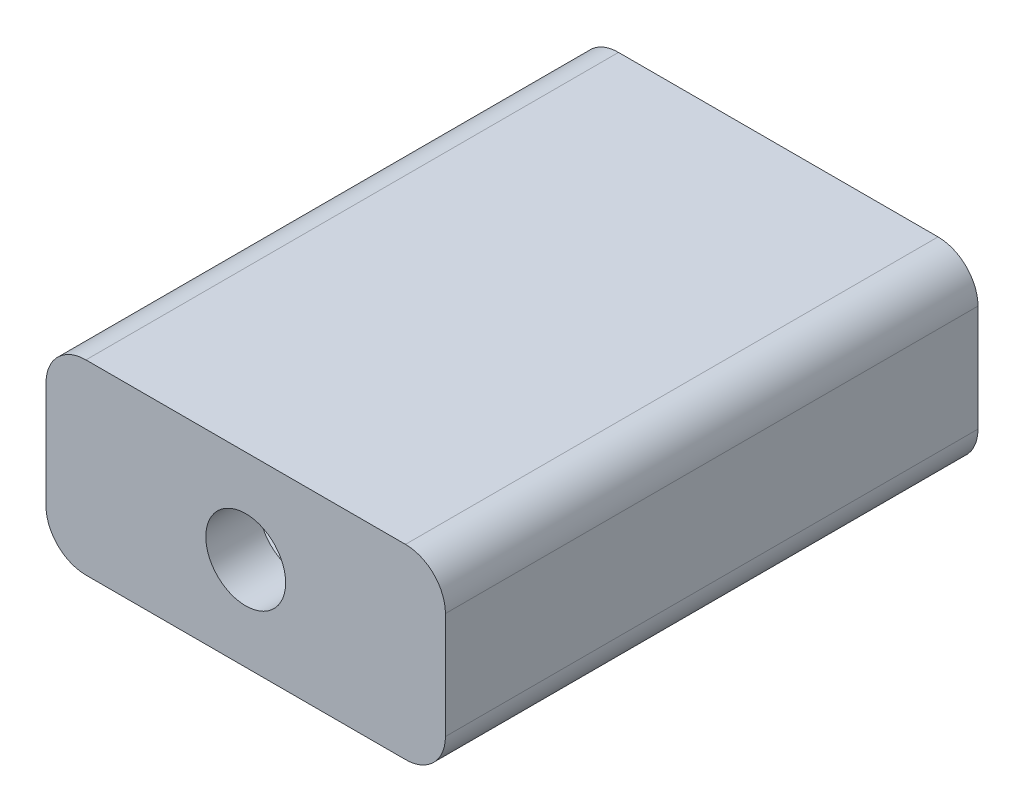
ISO-10303-21;
HEADER;
FILE_DESCRIPTION(('STEP AP214'),'2;1');
FILE_NAME('part.step','',(''),(''),'','','');
FILE_SCHEMA(('AUTOMOTIVE_DESIGN { 1 0 10303 214 1 1 1 1 }'));
ENDSEC;
DATA;
#1=APPLICATION_CONTEXT('core data for automotive mechanical design processes');
#2=APPLICATION_PROTOCOL_DEFINITION('international standard','automotive_design',2000,#1);
#3=PRODUCT_CONTEXT('',#1,'mechanical');
#4=PRODUCT('Part','Part','',(#3));
#5=PRODUCT_RELATED_PRODUCT_CATEGORY('part','',(#4));
#6=PRODUCT_DEFINITION_FORMATION('','',#4);
#7=PRODUCT_DEFINITION_CONTEXT('part definition',#1,'design');
#8=PRODUCT_DEFINITION('design','',#6,#7);
#9=PRODUCT_DEFINITION_SHAPE('','',#8);
#10=(LENGTH_UNIT() NAMED_UNIT(*) SI_UNIT(.MILLI.,.METRE.));
#11=(NAMED_UNIT(*) PLANE_ANGLE_UNIT() SI_UNIT($,.RADIAN.));
#12=(NAMED_UNIT(*) SI_UNIT($,.STERADIAN.) SOLID_ANGLE_UNIT());
#13=UNCERTAINTY_MEASURE_WITH_UNIT(LENGTH_MEASURE(1.E-05),#10,'distance_accuracy_value','');
#14=(GEOMETRIC_REPRESENTATION_CONTEXT(3) GLOBAL_UNCERTAINTY_ASSIGNED_CONTEXT((#13)) GLOBAL_UNIT_ASSIGNED_CONTEXT((#10,
#11,#12)) REPRESENTATION_CONTEXT('',''));
#15=CARTESIAN_POINT('',(0.,0.,0.));
#16=DIRECTION('',(0.,0.,1.));
#17=DIRECTION('',(1.,0.,0.));
#18=AXIS2_PLACEMENT_3D('',#15,#16,#17);
#19=CARTESIAN_POINT('',(-12.,-4.,40.));
#20=DIRECTION('',(0.,0.,-1.));
#21=DIRECTION('',(-1.,0.,0.));
#22=AXIS2_PLACEMENT_3D('',#19,#20,#21);
#23=CYLINDRICAL_SURFACE('',#22,3.);
#24=CARTESIAN_POINT('',(-12.,-4.,0.));
#25=DIRECTION('',(0.,0.,1.));
#26=DIRECTION('',(1.,0.,0.));
#27=AXIS2_PLACEMENT_3D('',#24,#25,#26);
#28=CIRCLE('',#27,3.);
#29=CARTESIAN_POINT('',(-15.,-4.,0.));
#30=VERTEX_POINT('',#29);
#31=CARTESIAN_POINT('',(-12.,-7.,0.));
#32=VERTEX_POINT('',#31);
#33=EDGE_CURVE('E145',#30,#32,#28,.T.);
#34=ORIENTED_EDGE('',*,*,#33,.T.);
#35=DIRECTION('',(0.,0.,-1.));
#36=VECTOR('',#35,1.);
#37=CARTESIAN_POINT('',(-12.,-7.,40.));
#38=LINE('',#37,#36);
#39=CARTESIAN_POINT('',(-12.,-7.,40.));
#40=VERTEX_POINT('',#39);
#41=EDGE_CURVE('E11',#40,#32,#38,.T.);
#42=ORIENTED_EDGE('',*,*,#41,.F.);
#43=CARTESIAN_POINT('',(-12.,-4.,40.));
#44=DIRECTION('',(0.,0.,1.));
#45=DIRECTION('',(1.,0.,0.));
#46=AXIS2_PLACEMENT_3D('',#43,#44,#45);
#47=CIRCLE('',#46,3.);
#48=CARTESIAN_POINT('',(-15.,-4.,40.));
#49=VERTEX_POINT('',#48);
#50=EDGE_CURVE('E161',#49,#40,#47,.T.);
#51=ORIENTED_EDGE('',*,*,#50,.F.);
#52=DIRECTION('',(0.,0.,-1.));
#53=VECTOR('',#52,1.);
#54=CARTESIAN_POINT('',(-15.,-4.,40.));
#55=LINE('',#54,#53);
#56=EDGE_CURVE('E141',#49,#30,#55,.T.);
#57=ORIENTED_EDGE('',*,*,#56,.T.);
#58=EDGE_LOOP('',(#34,#42,#51,#57));
#59=FACE_BOUND('',#58,.T.);
#60=ADVANCED_FACE('F36',(#59),#23,.T.);
#61=CARTESIAN_POINT('',(-12.,-7.,40.));
#62=DIRECTION('',(0.,1.,0.));
#63=DIRECTION('',(0.,0.,1.));
#64=AXIS2_PLACEMENT_3D('',#61,#62,#63);
#65=PLANE('',#64);
#66=DIRECTION('',(1.,0.,0.));
#67=VECTOR('',#66,1.);
#68=CARTESIAN_POINT('',(-12.,-7.,0.));
#69=LINE('',#68,#67);
#70=CARTESIAN_POINT('',(12.,-7.,0.));
#71=VERTEX_POINT('',#70);
#72=EDGE_CURVE('E148',#32,#71,#69,.T.);
#73=ORIENTED_EDGE('',*,*,#72,.T.);
#74=DIRECTION('',(0.,0.,-1.));
#75=VECTOR('',#74,1.);
#76=CARTESIAN_POINT('',(12.,-7.,40.));
#77=LINE('',#76,#75);
#78=CARTESIAN_POINT('',(12.,-7.,40.));
#79=VERTEX_POINT('',#78);
#80=EDGE_CURVE('E44',#79,#71,#77,.T.);
#81=ORIENTED_EDGE('',*,*,#80,.F.);
#82=DIRECTION('',(1.,0.,0.));
#83=VECTOR('',#82,1.);
#84=CARTESIAN_POINT('',(-12.,-7.,40.));
#85=LINE('',#84,#83);
#86=EDGE_CURVE('E101',#40,#79,#85,.T.);
#87=ORIENTED_EDGE('',*,*,#86,.F.);
#88=ORIENTED_EDGE('',*,*,#41,.T.);
#89=EDGE_LOOP('',(#73,#81,#87,#88));
#90=FACE_BOUND('',#89,.T.);
#91=ADVANCED_FACE('F245',(#90),#65,.F.);
#92=CARTESIAN_POINT('',(12.,-4.,40.));
#93=DIRECTION('',(0.,0.,-1.));
#94=DIRECTION('',(-1.,0.,0.));
#95=AXIS2_PLACEMENT_3D('',#92,#93,#94);
#96=CYLINDRICAL_SURFACE('',#95,3.);
#97=CARTESIAN_POINT('',(12.,-4.,0.));
#98=DIRECTION('',(0.,0.,1.));
#99=DIRECTION('',(1.,0.,0.));
#100=AXIS2_PLACEMENT_3D('',#97,#98,#99);
#101=CIRCLE('',#100,3.);
#102=CARTESIAN_POINT('',(15.,-4.,0.));
#103=VERTEX_POINT('',#102);
#104=EDGE_CURVE('E151',#71,#103,#101,.T.);
#105=ORIENTED_EDGE('',*,*,#104,.T.);
#106=DIRECTION('',(0.,0.,-1.));
#107=VECTOR('',#106,1.);
#108=CARTESIAN_POINT('',(15.,-4.,40.));
#109=LINE('',#108,#107);
#110=CARTESIAN_POINT('',(15.,-4.,40.));
#111=VERTEX_POINT('',#110);
#112=EDGE_CURVE('E168',#111,#103,#109,.T.);
#113=ORIENTED_EDGE('',*,*,#112,.F.);
#114=CARTESIAN_POINT('',(12.,-4.,40.));
#115=DIRECTION('',(0.,0.,1.));
#116=DIRECTION('',(1.,0.,0.));
#117=AXIS2_PLACEMENT_3D('',#114,#115,#116);
#118=CIRCLE('',#117,3.);
#119=EDGE_CURVE('E177',#79,#111,#118,.T.);
#120=ORIENTED_EDGE('',*,*,#119,.F.);
#121=ORIENTED_EDGE('',*,*,#80,.T.);
#122=EDGE_LOOP('',(#105,#113,#120,#121));
#123=FACE_BOUND('',#122,.T.);
#124=ADVANCED_FACE('F175',(#123),#96,.T.);
#125=CARTESIAN_POINT('',(15.,-4.,40.));
#126=DIRECTION('',(-1.,0.,0.));
#127=DIRECTION('',(0.,0.,1.));
#128=AXIS2_PLACEMENT_3D('',#125,#126,#127);
#129=PLANE('',#128);
#130=DIRECTION('',(0.,1.,0.));
#131=VECTOR('',#130,1.);
#132=CARTESIAN_POINT('',(15.,-4.,0.));
#133=LINE('',#132,#131);
#134=CARTESIAN_POINT('',(15.,4.,0.));
#135=VERTEX_POINT('',#134);
#136=EDGE_CURVE('E153',#103,#135,#133,.T.);
#137=ORIENTED_EDGE('',*,*,#136,.T.);
#138=DIRECTION('',(0.,0.,-1.));
#139=VECTOR('',#138,1.);
#140=CARTESIAN_POINT('',(15.,4.,40.));
#141=LINE('',#140,#139);
#142=CARTESIAN_POINT('',(15.,4.,40.));
#143=VERTEX_POINT('',#142);
#144=EDGE_CURVE('E165',#143,#135,#141,.T.);
#145=ORIENTED_EDGE('',*,*,#144,.F.);
#146=DIRECTION('',(0.,1.,0.));
#147=VECTOR('',#146,1.);
#148=CARTESIAN_POINT('',(15.,-4.,40.));
#149=LINE('',#148,#147);
#150=EDGE_CURVE('E189',#111,#143,#149,.T.);
#151=ORIENTED_EDGE('',*,*,#150,.F.);
#152=ORIENTED_EDGE('',*,*,#112,.T.);
#153=EDGE_LOOP('',(#137,#145,#151,#152));
#154=FACE_BOUND('',#153,.T.);
#155=ADVANCED_FACE('F185',(#154),#129,.F.);
#156=CARTESIAN_POINT('',(12.,4.,40.));
#157=DIRECTION('',(0.,0.,-1.));
#158=DIRECTION('',(-1.,0.,0.));
#159=AXIS2_PLACEMENT_3D('',#156,#157,#158);
#160=CYLINDRICAL_SURFACE('',#159,3.);
#161=CARTESIAN_POINT('',(12.,4.,0.));
#162=DIRECTION('',(0.,0.,1.));
#163=DIRECTION('',(1.,0.,0.));
#164=AXIS2_PLACEMENT_3D('',#161,#162,#163);
#165=CIRCLE('',#164,3.);
#166=CARTESIAN_POINT('',(12.,7.,0.));
#167=VERTEX_POINT('',#166);
#168=EDGE_CURVE('E155',#135,#167,#165,.T.);
#169=ORIENTED_EDGE('',*,*,#168,.T.);
#170=DIRECTION('',(0.,0.,-1.));
#171=VECTOR('',#170,1.);
#172=CARTESIAN_POINT('',(12.,7.,40.));
#173=LINE('',#172,#171);
#174=CARTESIAN_POINT('',(12.,7.,40.));
#175=VERTEX_POINT('',#174);
#176=EDGE_CURVE('E136',#175,#167,#173,.T.);
#177=ORIENTED_EDGE('',*,*,#176,.F.);
#178=CARTESIAN_POINT('',(12.,4.,40.));
#179=DIRECTION('',(0.,0.,1.));
#180=DIRECTION('',(1.,0.,0.));
#181=AXIS2_PLACEMENT_3D('',#178,#179,#180);
#182=CIRCLE('',#181,3.);
#183=EDGE_CURVE('E124',#143,#175,#182,.T.);
#184=ORIENTED_EDGE('',*,*,#183,.F.);
#185=ORIENTED_EDGE('',*,*,#144,.T.);
#186=EDGE_LOOP('',(#169,#177,#184,#185));
#187=FACE_BOUND('',#186,.T.);
#188=ADVANCED_FACE('F188',(#187),#160,.T.);
#189=CARTESIAN_POINT('',(12.,7.,40.));
#190=DIRECTION('',(0.,-1.,0.));
#191=DIRECTION('',(0.,0.,-1.));
#192=AXIS2_PLACEMENT_3D('',#189,#190,#191);
#193=PLANE('',#192);
#194=DIRECTION('',(-1.,0.,0.));
#195=VECTOR('',#194,1.);
#196=CARTESIAN_POINT('',(12.,7.,0.));
#197=LINE('',#196,#195);
#198=CARTESIAN_POINT('',(-12.,7.,0.));
#199=VERTEX_POINT('',#198);
#200=EDGE_CURVE('E133',#167,#199,#197,.T.);
#201=ORIENTED_EDGE('',*,*,#200,.T.);
#202=DIRECTION('',(0.,0.,-1.));
#203=VECTOR('',#202,1.);
#204=CARTESIAN_POINT('',(-12.,7.,40.));
#205=LINE('',#204,#203);
#206=CARTESIAN_POINT('',(-12.,7.,40.));
#207=VERTEX_POINT('',#206);
#208=EDGE_CURVE('E130',#207,#199,#205,.T.);
#209=ORIENTED_EDGE('',*,*,#208,.F.);
#210=DIRECTION('',(-1.,0.,0.));
#211=VECTOR('',#210,1.);
#212=CARTESIAN_POINT('',(12.,7.,40.));
#213=LINE('',#212,#211);
#214=EDGE_CURVE('E117',#175,#207,#213,.T.);
#215=ORIENTED_EDGE('',*,*,#214,.F.);
#216=ORIENTED_EDGE('',*,*,#176,.T.);
#217=EDGE_LOOP('',(#201,#209,#215,#216));
#218=FACE_BOUND('',#217,.T.);
#219=ADVANCED_FACE('F131',(#218),#193,.F.);
#220=CARTESIAN_POINT('',(-12.,4.,40.));
#221=DIRECTION('',(0.,0.,-1.));
#222=DIRECTION('',(-1.,0.,0.));
#223=AXIS2_PLACEMENT_3D('',#220,#221,#222);
#224=CYLINDRICAL_SURFACE('',#223,3.);
#225=CARTESIAN_POINT('',(-12.,4.,0.));
#226=DIRECTION('',(0.,0.,1.));
#227=DIRECTION('',(1.,0.,0.));
#228=AXIS2_PLACEMENT_3D('',#225,#226,#227);
#229=CIRCLE('',#228,3.);
#230=CARTESIAN_POINT('',(-15.,4.,0.));
#231=VERTEX_POINT('',#230);
#232=EDGE_CURVE('E158',#199,#231,#229,.T.);
#233=ORIENTED_EDGE('',*,*,#232,.T.);
#234=DIRECTION('',(0.,0.,-1.));
#235=VECTOR('',#234,1.);
#236=CARTESIAN_POINT('',(-15.,4.,40.));
#237=LINE('',#236,#235);
#238=CARTESIAN_POINT('',(-15.,4.,40.));
#239=VERTEX_POINT('',#238);
#240=EDGE_CURVE('E137',#239,#231,#237,.T.);
#241=ORIENTED_EDGE('',*,*,#240,.F.);
#242=CARTESIAN_POINT('',(-12.,4.,40.));
#243=DIRECTION('',(0.,0.,1.));
#244=DIRECTION('',(1.,0.,0.));
#245=AXIS2_PLACEMENT_3D('',#242,#243,#244);
#246=CIRCLE('',#245,3.);
#247=EDGE_CURVE('E121',#207,#239,#246,.T.);
#248=ORIENTED_EDGE('',*,*,#247,.F.);
#249=ORIENTED_EDGE('',*,*,#208,.T.);
#250=EDGE_LOOP('',(#233,#241,#248,#249));
#251=FACE_BOUND('',#250,.T.);
#252=ADVANCED_FACE('F139',(#251),#224,.T.);
#253=CARTESIAN_POINT('',(-15.,4.,40.));
#254=DIRECTION('',(1.,0.,0.));
#255=DIRECTION('',(0.,0.,-1.));
#256=AXIS2_PLACEMENT_3D('',#253,#254,#255);
#257=PLANE('',#256);
#258=DIRECTION('',(0.,-1.,0.));
#259=VECTOR('',#258,1.);
#260=CARTESIAN_POINT('',(-15.,4.,0.));
#261=LINE('',#260,#259);
#262=EDGE_CURVE('E93',#231,#30,#261,.T.);
#263=ORIENTED_EDGE('',*,*,#262,.T.);
#264=ORIENTED_EDGE('',*,*,#56,.F.);
#265=DIRECTION('',(0.,-1.,0.));
#266=VECTOR('',#265,1.);
#267=CARTESIAN_POINT('',(-15.,4.,40.));
#268=LINE('',#267,#266);
#269=EDGE_CURVE('E60',#239,#49,#268,.T.);
#270=ORIENTED_EDGE('',*,*,#269,.F.);
#271=ORIENTED_EDGE('',*,*,#240,.T.);
#272=EDGE_LOOP('',(#263,#264,#270,#271));
#273=FACE_BOUND('',#272,.T.);
#274=ADVANCED_FACE('F252',(#273),#257,.F.);
#275=CARTESIAN_POINT('',(-12.,-4.,40.));
#276=DIRECTION('',(0.,0.,1.));
#277=DIRECTION('',(1.,0.,0.));
#278=AXIS2_PLACEMENT_3D('',#275,#276,#277);
#279=PLANE('',#278);
#280=CARTESIAN_POINT('',(0.,0.,40.));
#281=DIRECTION('',(0.,0.,1.));
#282=DIRECTION('',(1.,0.,0.));
#283=AXIS2_PLACEMENT_3D('',#280,#281,#282);
#284=CIRCLE('',#283,3.);
#285=CARTESIAN_POINT('',(3.,0.,40.));
#286=VERTEX_POINT('',#285);
#287=EDGE_CURVE('E226',#286,#286,#284,.T.);
#288=ORIENTED_EDGE('',*,*,#287,.F.);
#289=EDGE_LOOP('',(#288));
#290=FACE_BOUND('',#289,.T.);
#291=ORIENTED_EDGE('',*,*,#50,.T.);
#292=ORIENTED_EDGE('',*,*,#86,.T.);
#293=ORIENTED_EDGE('',*,*,#119,.T.);
#294=ORIENTED_EDGE('',*,*,#150,.T.);
#295=ORIENTED_EDGE('',*,*,#183,.T.);
#296=ORIENTED_EDGE('',*,*,#214,.T.);
#297=ORIENTED_EDGE('',*,*,#247,.T.);
#298=ORIENTED_EDGE('',*,*,#269,.T.);
#299=EDGE_LOOP('',(#291,#292,#293,#294,#295,#296,#297,#298));
#300=FACE_BOUND('',#299,.T.);
#301=ADVANCED_FACE('F119',(#290,#300),#279,.T.);
#302=CARTESIAN_POINT('',(-12.,-4.,0.));
#303=DIRECTION('',(0.,0.,1.));
#304=DIRECTION('',(1.,0.,0.));
#305=AXIS2_PLACEMENT_3D('',#302,#303,#304);
#306=PLANE('',#305);
#307=DIRECTION('',(1.,0.,0.));
#308=VECTOR('',#307,1.);
#309=CARTESIAN_POINT('',(12.3,4.5,0.));
#310=LINE('',#309,#308);
#311=CARTESIAN_POINT('',(-12.3,4.5,0.));
#312=VERTEX_POINT('',#311);
#313=CARTESIAN_POINT('',(12.3,4.5,0.));
#314=VERTEX_POINT('',#313);
#315=EDGE_CURVE('E212',#312,#314,#310,.T.);
#316=ORIENTED_EDGE('',*,*,#315,.F.);
#317=DIRECTION('',(0.,1.,0.));
#318=VECTOR('',#317,1.);
#319=CARTESIAN_POINT('',(-12.3,-4.5,0.));
#320=LINE('',#319,#318);
#321=CARTESIAN_POINT('',(-12.3,-4.5,0.));
#322=VERTEX_POINT('',#321);
#323=EDGE_CURVE('E51',#322,#312,#320,.T.);
#324=ORIENTED_EDGE('',*,*,#323,.F.);
#325=DIRECTION('',(-1.,0.,0.));
#326=VECTOR('',#325,1.);
#327=CARTESIAN_POINT('',(12.3,-4.5,0.));
#328=LINE('',#327,#326);
#329=CARTESIAN_POINT('',(12.3,-4.5,0.));
#330=VERTEX_POINT('',#329);
#331=EDGE_CURVE('E205',#330,#322,#328,.T.);
#332=ORIENTED_EDGE('',*,*,#331,.F.);
#333=DIRECTION('',(0.,-1.,0.));
#334=VECTOR('',#333,1.);
#335=CARTESIAN_POINT('',(12.3,-4.5,0.));
#336=LINE('',#335,#334);
#337=EDGE_CURVE('E209',#314,#330,#336,.T.);
#338=ORIENTED_EDGE('',*,*,#337,.F.);
#339=EDGE_LOOP('',(#316,#324,#332,#338));
#340=FACE_BOUND('',#339,.T.);
#341=ORIENTED_EDGE('',*,*,#33,.F.);
#342=ORIENTED_EDGE('',*,*,#262,.F.);
#343=ORIENTED_EDGE('',*,*,#232,.F.);
#344=ORIENTED_EDGE('',*,*,#200,.F.);
#345=ORIENTED_EDGE('',*,*,#168,.F.);
#346=ORIENTED_EDGE('',*,*,#136,.F.);
#347=ORIENTED_EDGE('',*,*,#104,.F.);
#348=ORIENTED_EDGE('',*,*,#72,.F.);
#349=EDGE_LOOP('',(#341,#342,#343,#344,#345,#346,#347,#348));
#350=FACE_BOUND('',#349,.T.);
#351=ADVANCED_FACE('F181',(#340,#350),#306,.F.);
#352=CARTESIAN_POINT('',(-12.3,-4.5,36.));
#353=DIRECTION('',(-1.,0.,0.));
#354=DIRECTION('',(0.,0.,1.));
#355=AXIS2_PLACEMENT_3D('',#352,#353,#354);
#356=PLANE('',#355);
#357=ORIENTED_EDGE('',*,*,#323,.T.);
#358=DIRECTION('',(0.,0.,-1.));
#359=VECTOR('',#358,1.);
#360=CARTESIAN_POINT('',(-12.3,4.5,36.));
#361=LINE('',#360,#359);
#362=CARTESIAN_POINT('',(-12.3,4.5,36.));
#363=VERTEX_POINT('',#362);
#364=EDGE_CURVE('E195',#363,#312,#361,.T.);
#365=ORIENTED_EDGE('',*,*,#364,.F.);
#366=DIRECTION('',(0.,1.,0.));
#367=VECTOR('',#366,1.);
#368=CARTESIAN_POINT('',(-12.3,-4.5,36.));
#369=LINE('',#368,#367);
#370=CARTESIAN_POINT('',(-12.3,-4.5,36.));
#371=VERTEX_POINT('',#370);
#372=EDGE_CURVE('E208',#371,#363,#369,.T.);
#373=ORIENTED_EDGE('',*,*,#372,.F.);
#374=DIRECTION('',(0.,0.,-1.));
#375=VECTOR('',#374,1.);
#376=CARTESIAN_POINT('',(-12.3,-4.5,36.));
#377=LINE('',#376,#375);
#378=EDGE_CURVE('E149',#371,#322,#377,.T.);
#379=ORIENTED_EDGE('',*,*,#378,.T.);
#380=EDGE_LOOP('',(#357,#365,#373,#379));
#381=FACE_BOUND('',#380,.T.);
#382=ADVANCED_FACE('F307',(#381),#356,.F.);
#383=CARTESIAN_POINT('',(12.3,-4.5,36.));
#384=DIRECTION('',(0.,-1.,0.));
#385=DIRECTION('',(0.,0.,-1.));
#386=AXIS2_PLACEMENT_3D('',#383,#384,#385);
#387=PLANE('',#386);
#388=ORIENTED_EDGE('',*,*,#331,.T.);
#389=ORIENTED_EDGE('',*,*,#378,.F.);
#390=DIRECTION('',(-1.,0.,0.));
#391=VECTOR('',#390,1.);
#392=CARTESIAN_POINT('',(12.3,-4.5,36.));
#393=LINE('',#392,#391);
#394=CARTESIAN_POINT('',(12.3,-4.5,36.));
#395=VERTEX_POINT('',#394);
#396=EDGE_CURVE('E198',#395,#371,#393,.T.);
#397=ORIENTED_EDGE('',*,*,#396,.F.);
#398=DIRECTION('',(0.,0.,-1.));
#399=VECTOR('',#398,1.);
#400=CARTESIAN_POINT('',(12.3,-4.5,36.));
#401=LINE('',#400,#399);
#402=EDGE_CURVE('E201',#395,#330,#401,.T.);
#403=ORIENTED_EDGE('',*,*,#402,.T.);
#404=EDGE_LOOP('',(#388,#389,#397,#403));
#405=FACE_BOUND('',#404,.T.);
#406=ADVANCED_FACE('F317',(#405),#387,.F.);
#407=CARTESIAN_POINT('',(12.3,-4.5,36.));
#408=DIRECTION('',(1.,0.,0.));
#409=DIRECTION('',(0.,0.,-1.));
#410=AXIS2_PLACEMENT_3D('',#407,#408,#409);
#411=PLANE('',#410);
#412=ORIENTED_EDGE('',*,*,#337,.T.);
#413=ORIENTED_EDGE('',*,*,#402,.F.);
#414=DIRECTION('',(0.,-1.,0.));
#415=VECTOR('',#414,1.);
#416=CARTESIAN_POINT('',(12.3,-4.5,36.));
#417=LINE('',#416,#415);
#418=CARTESIAN_POINT('',(12.3,4.5,36.));
#419=VERTEX_POINT('',#418);
#420=EDGE_CURVE('E218',#419,#395,#417,.T.);
#421=ORIENTED_EDGE('',*,*,#420,.F.);
#422=DIRECTION('',(0.,0.,-1.));
#423=VECTOR('',#422,1.);
#424=CARTESIAN_POINT('',(12.3,4.5,36.));
#425=LINE('',#424,#423);
#426=EDGE_CURVE('E197',#419,#314,#425,.T.);
#427=ORIENTED_EDGE('',*,*,#426,.T.);
#428=EDGE_LOOP('',(#412,#413,#421,#427));
#429=FACE_BOUND('',#428,.T.);
#430=ADVANCED_FACE('F327',(#429),#411,.F.);
#431=CARTESIAN_POINT('',(12.3,4.5,36.));
#432=DIRECTION('',(0.,1.,0.));
#433=DIRECTION('',(0.,0.,1.));
#434=AXIS2_PLACEMENT_3D('',#431,#432,#433);
#435=PLANE('',#434);
#436=ORIENTED_EDGE('',*,*,#315,.T.);
#437=ORIENTED_EDGE('',*,*,#426,.F.);
#438=DIRECTION('',(1.,0.,0.));
#439=VECTOR('',#438,1.);
#440=CARTESIAN_POINT('',(12.3,4.5,36.));
#441=LINE('',#440,#439);
#442=EDGE_CURVE('E221',#363,#419,#441,.T.);
#443=ORIENTED_EDGE('',*,*,#442,.F.);
#444=ORIENTED_EDGE('',*,*,#364,.T.);
#445=EDGE_LOOP('',(#436,#437,#443,#444));
#446=FACE_BOUND('',#445,.T.);
#447=ADVANCED_FACE('F242',(#446),#435,.F.);
#448=CARTESIAN_POINT('',(0.,0.,36.));
#449=DIRECTION('',(0.,0.,1.));
#450=DIRECTION('',(1.,0.,0.));
#451=AXIS2_PLACEMENT_3D('',#448,#449,#450);
#452=PLANE('',#451);
#453=CARTESIAN_POINT('',(0.,0.,36.));
#454=DIRECTION('',(0.,0.,1.));
#455=DIRECTION('',(1.,0.,0.));
#456=AXIS2_PLACEMENT_3D('',#453,#454,#455);
#457=CIRCLE('',#456,3.);
#458=CARTESIAN_POINT('',(3.,0.,36.));
#459=VERTEX_POINT('',#458);
#460=EDGE_CURVE('E39',#459,#459,#457,.T.);
#461=ORIENTED_EDGE('',*,*,#460,.T.);
#462=EDGE_LOOP('',(#461));
#463=FACE_BOUND('',#462,.T.);
#464=ORIENTED_EDGE('',*,*,#372,.T.);
#465=ORIENTED_EDGE('',*,*,#442,.T.);
#466=ORIENTED_EDGE('',*,*,#420,.T.);
#467=ORIENTED_EDGE('',*,*,#396,.T.);
#468=EDGE_LOOP('',(#464,#465,#466,#467));
#469=FACE_BOUND('',#468,.T.);
#470=ADVANCED_FACE('F233',(#463,#469),#452,.F.);
#471=CARTESIAN_POINT('',(0.,0.,35.5));
#472=DIRECTION('',(0.,0.,1.));
#473=DIRECTION('',(1.,0.,0.));
#474=AXIS2_PLACEMENT_3D('',#471,#472,#473);
#475=CYLINDRICAL_SURFACE('',#474,3.);
#476=ORIENTED_EDGE('',*,*,#287,.T.);
#477=EDGE_LOOP('',(#476));
#478=FACE_BOUND('',#477,.T.);
#479=ORIENTED_EDGE('',*,*,#460,.F.);
#480=EDGE_LOOP('',(#479));
#481=FACE_BOUND('',#480,.T.);
#482=ADVANCED_FACE('F236',(#478,#481),#475,.F.);
#483=CLOSED_SHELL('',(#60,#91,#124,#155,#188,#219,#252,#274,#301,#351,#382,#406,#430,#447,#470,#482));
#484=MANIFOLD_SOLID_BREP('B2',#483);
#485=ADVANCED_BREP_SHAPE_REPRESENTATION('',(#18,#484),#14);
#486=SHAPE_DEFINITION_REPRESENTATION(#9,#485);
ENDSEC;
END-ISO-10303-21;
